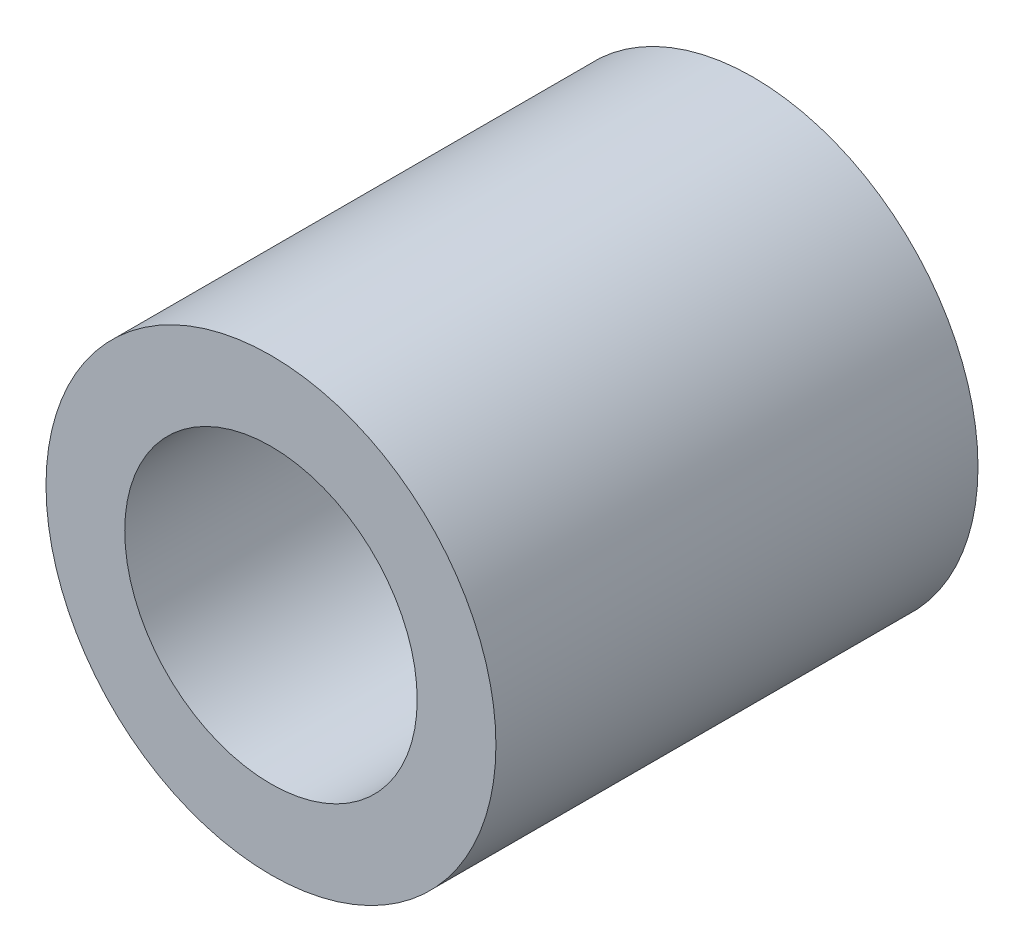
ISO-10303-21;
HEADER;
FILE_DESCRIPTION(('STEP AP214'),'2;1');
FILE_NAME('part.step','',(''),(''),'','','');
FILE_SCHEMA(('AUTOMOTIVE_DESIGN { 1 0 10303 214 1 1 1 1 }'));
ENDSEC;
DATA;
#1=APPLICATION_CONTEXT('core data for automotive mechanical design processes');
#2=APPLICATION_PROTOCOL_DEFINITION('international standard','automotive_design',2000,#1);
#3=PRODUCT_CONTEXT('',#1,'mechanical');
#4=PRODUCT('Part','Part','',(#3));
#5=PRODUCT_RELATED_PRODUCT_CATEGORY('part','',(#4));
#6=PRODUCT_DEFINITION_FORMATION('','',#4);
#7=PRODUCT_DEFINITION_CONTEXT('part definition',#1,'design');
#8=PRODUCT_DEFINITION('design','',#6,#7);
#9=PRODUCT_DEFINITION_SHAPE('','',#8);
#10=(LENGTH_UNIT() NAMED_UNIT(*) SI_UNIT(.MILLI.,.METRE.));
#11=(NAMED_UNIT(*) PLANE_ANGLE_UNIT() SI_UNIT($,.RADIAN.));
#12=(NAMED_UNIT(*) SI_UNIT($,.STERADIAN.) SOLID_ANGLE_UNIT());
#13=UNCERTAINTY_MEASURE_WITH_UNIT(LENGTH_MEASURE(1.E-05),#10,'distance_accuracy_value','');
#14=(GEOMETRIC_REPRESENTATION_CONTEXT(3) GLOBAL_UNCERTAINTY_ASSIGNED_CONTEXT((#13)) GLOBAL_UNIT_ASSIGNED_CONTEXT((#10,
#11,#12)) REPRESENTATION_CONTEXT('',''));
#15=CARTESIAN_POINT('',(0.,0.,0.));
#16=DIRECTION('',(0.,0.,1.));
#17=DIRECTION('',(1.,0.,0.));
#18=AXIS2_PLACEMENT_3D('',#15,#16,#17);
#19=CARTESIAN_POINT('',(0.,0.,22.86));
#20=DIRECTION('',(0.,0.,1.));
#21=DIRECTION('',(1.,0.,0.));
#22=AXIS2_PLACEMENT_3D('',#19,#20,#21);
#23=PLANE('',#22);
#24=CARTESIAN_POINT('',(0.,0.,22.86));
#25=DIRECTION('',(0.,0.,1.));
#26=DIRECTION('',(1.,0.,0.));
#27=AXIS2_PLACEMENT_3D('',#24,#25,#26);
#28=CIRCLE('',#27,10.668);
#29=CARTESIAN_POINT('',(10.668,0.,22.86));
#30=VERTEX_POINT('',#29);
#31=EDGE_CURVE('E10',#30,#30,#28,.T.);
#32=ORIENTED_EDGE('',*,*,#31,.T.);
#33=EDGE_LOOP('',(#32));
#34=FACE_BOUND('',#33,.T.);
#35=CARTESIAN_POINT('',(0.,0.,22.86));
#36=DIRECTION('',(0.,0.,1.));
#37=DIRECTION('',(1.,0.,0.));
#38=AXIS2_PLACEMENT_3D('',#35,#36,#37);
#39=CIRCLE('',#38,6.9342);
#40=CARTESIAN_POINT('',(6.9342,0.,22.86));
#41=VERTEX_POINT('',#40);
#42=EDGE_CURVE('E42',#41,#41,#39,.T.);
#43=ORIENTED_EDGE('',*,*,#42,.F.);
#44=EDGE_LOOP('',(#43));
#45=FACE_BOUND('',#44,.T.);
#46=ADVANCED_FACE('F31',(#34,#45),#23,.T.);
#47=CARTESIAN_POINT('',(0.,0.,0.));
#48=DIRECTION('',(0.,0.,1.));
#49=DIRECTION('',(1.,0.,0.));
#50=AXIS2_PLACEMENT_3D('',#47,#48,#49);
#51=PLANE('',#50);
#52=CARTESIAN_POINT('',(0.,0.,0.));
#53=DIRECTION('',(0.,0.,1.));
#54=DIRECTION('',(1.,0.,0.));
#55=AXIS2_PLACEMENT_3D('',#52,#53,#54);
#56=CIRCLE('',#55,10.668);
#57=CARTESIAN_POINT('',(10.668,0.,0.));
#58=VERTEX_POINT('',#57);
#59=EDGE_CURVE('E35',#58,#58,#56,.T.);
#60=ORIENTED_EDGE('',*,*,#59,.F.);
#61=EDGE_LOOP('',(#60));
#62=FACE_BOUND('',#61,.T.);
#63=CARTESIAN_POINT('',(0.,0.,0.));
#64=DIRECTION('',(0.,0.,1.));
#65=DIRECTION('',(1.,0.,0.));
#66=AXIS2_PLACEMENT_3D('',#63,#64,#65);
#67=CIRCLE('',#66,6.9342);
#68=CARTESIAN_POINT('',(6.9342,0.,0.));
#69=VERTEX_POINT('',#68);
#70=EDGE_CURVE('E44',#69,#69,#67,.T.);
#71=ORIENTED_EDGE('',*,*,#70,.T.);
#72=EDGE_LOOP('',(#71));
#73=FACE_BOUND('',#72,.T.);
#74=ADVANCED_FACE('F54',(#62,#73),#51,.F.);
#75=CARTESIAN_POINT('',(0.,0.,22.86));
#76=DIRECTION('',(0.,0.,-1.));
#77=DIRECTION('',(-1.,0.,0.));
#78=AXIS2_PLACEMENT_3D('',#75,#76,#77);
#79=CYLINDRICAL_SURFACE('',#78,10.668);
#80=ORIENTED_EDGE('',*,*,#31,.F.);
#81=EDGE_LOOP('',(#80));
#82=FACE_BOUND('',#81,.T.);
#83=ORIENTED_EDGE('',*,*,#59,.T.);
#84=EDGE_LOOP('',(#83));
#85=FACE_BOUND('',#84,.T.);
#86=ADVANCED_FACE('F33',(#82,#85),#79,.T.);
#87=CARTESIAN_POINT('',(0.,0.,22.86));
#88=DIRECTION('',(0.,0.,-1.));
#89=DIRECTION('',(-1.,0.,0.));
#90=AXIS2_PLACEMENT_3D('',#87,#88,#89);
#91=CYLINDRICAL_SURFACE('',#90,6.9342);
#92=ORIENTED_EDGE('',*,*,#42,.T.);
#93=EDGE_LOOP('',(#92));
#94=FACE_BOUND('',#93,.T.);
#95=ORIENTED_EDGE('',*,*,#70,.F.);
#96=EDGE_LOOP('',(#95));
#97=FACE_BOUND('',#96,.T.);
#98=ADVANCED_FACE('F50',(#94,#97),#91,.F.);
#99=CLOSED_SHELL('',(#46,#74,#86,#98));
#100=MANIFOLD_SOLID_BREP('B2',#99);
#101=ADVANCED_BREP_SHAPE_REPRESENTATION('',(#18,#100),#14);
#102=SHAPE_DEFINITION_REPRESENTATION(#9,#101);
ENDSEC;
END-ISO-10303-21;
